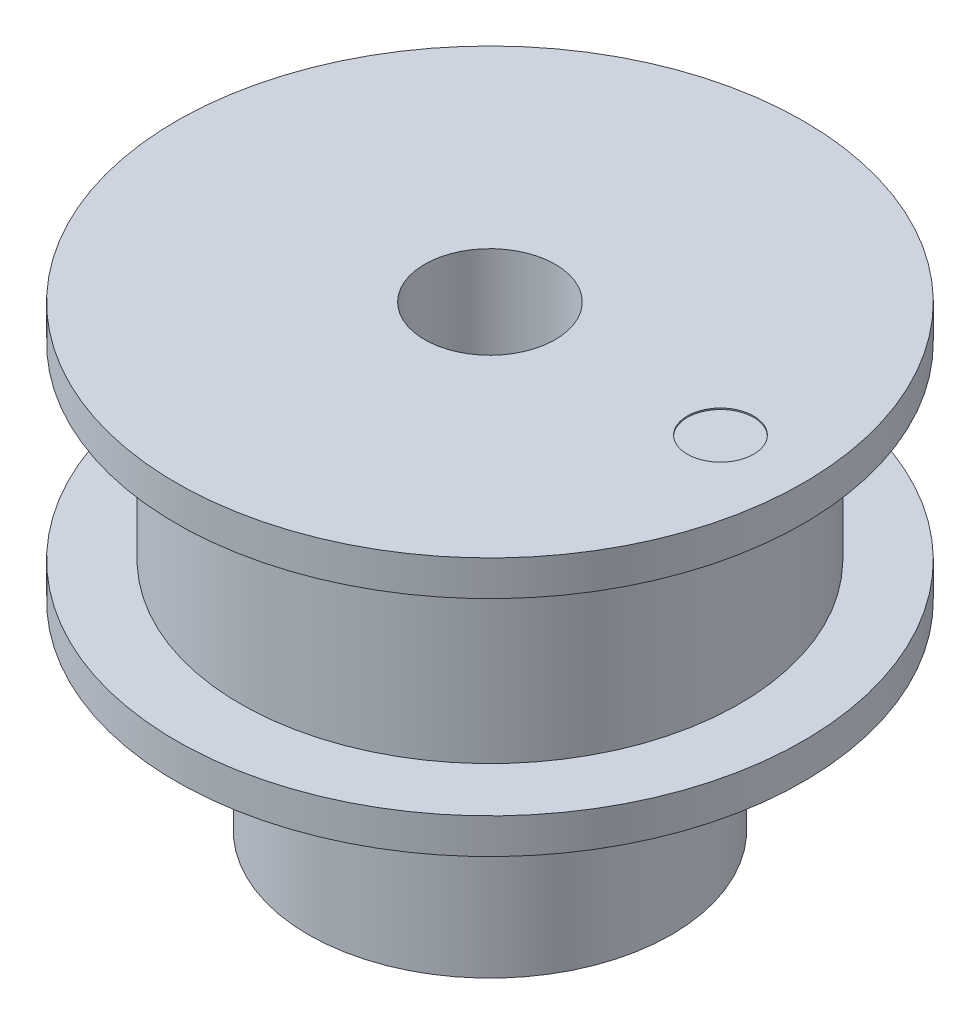
ISO-10303-21;
HEADER;
FILE_DESCRIPTION(('STEP AP214'),'2;1');
FILE_NAME('part.step','',(''),(''),'','','');
FILE_SCHEMA(('AUTOMOTIVE_DESIGN { 1 0 10303 214 1 1 1 1 }'));
ENDSEC;
DATA;
#1=APPLICATION_CONTEXT('core data for automotive mechanical design processes');
#2=APPLICATION_PROTOCOL_DEFINITION('international standard','automotive_design',2000,#1);
#3=PRODUCT_CONTEXT('',#1,'mechanical');
#4=PRODUCT('Part','Part','',(#3));
#5=PRODUCT_RELATED_PRODUCT_CATEGORY('part','',(#4));
#6=PRODUCT_DEFINITION_FORMATION('','',#4);
#7=PRODUCT_DEFINITION_CONTEXT('part definition',#1,'design');
#8=PRODUCT_DEFINITION('design','',#6,#7);
#9=PRODUCT_DEFINITION_SHAPE('','',#8);
#10=(LENGTH_UNIT() NAMED_UNIT(*) SI_UNIT(.MILLI.,.METRE.));
#11=(NAMED_UNIT(*) PLANE_ANGLE_UNIT() SI_UNIT($,.RADIAN.));
#12=(NAMED_UNIT(*) SI_UNIT($,.STERADIAN.) SOLID_ANGLE_UNIT());
#13=UNCERTAINTY_MEASURE_WITH_UNIT(LENGTH_MEASURE(1.E-05),#10,'distance_accuracy_value','');
#14=(GEOMETRIC_REPRESENTATION_CONTEXT(3) GLOBAL_UNCERTAINTY_ASSIGNED_CONTEXT((#13)) GLOBAL_UNIT_ASSIGNED_CONTEXT((#10,
#11,#12)) REPRESENTATION_CONTEXT('',''));
#15=CARTESIAN_POINT('',(0.,0.,0.));
#16=DIRECTION('',(0.,0.,1.));
#17=DIRECTION('',(1.,0.,0.));
#18=AXIS2_PLACEMENT_3D('',#15,#16,#17);
#19=CARTESIAN_POINT('',(12.,17.5,0.));
#20=DIRECTION('',(0.,1.,0.));
#21=DIRECTION('',(0.,0.,1.));
#22=AXIS2_PLACEMENT_3D('',#19,#20,#21);
#23=PLANE('',#22);
#24=CARTESIAN_POINT('',(8.825,17.5,0.));
#25=DIRECTION('',(0.,1.,0.));
#26=DIRECTION('',(0.,0.,1.));
#27=AXIS2_PLACEMENT_3D('',#24,#25,#26);
#28=CIRCLE('',#27,1.27);
#29=CARTESIAN_POINT('',(8.825,17.5,1.27));
#30=VERTEX_POINT('',#29);
#31=EDGE_CURVE('E68',#30,#30,#28,.T.);
#32=ORIENTED_EDGE('',*,*,#31,.F.);
#33=EDGE_LOOP('',(#32));
#34=FACE_BOUND('',#33,.T.);
#35=CARTESIAN_POINT('',(0.,17.5,0.));
#36=DIRECTION('',(0.,-1.,0.));
#37=DIRECTION('',(0.,0.,-1.));
#38=AXIS2_PLACEMENT_3D('',#35,#36,#37);
#39=CIRCLE('',#38,2.5);
#40=CARTESIAN_POINT('',(0.,17.5,-2.5));
#41=VERTEX_POINT('',#40);
#42=EDGE_CURVE('E64',#41,#41,#39,.T.);
#43=ORIENTED_EDGE('',*,*,#42,.T.);
#44=EDGE_LOOP('',(#43));
#45=FACE_BOUND('',#44,.T.);
#46=CARTESIAN_POINT('',(0.,17.5,0.));
#47=DIRECTION('',(0.,-1.,0.));
#48=DIRECTION('',(0.,0.,-1.));
#49=AXIS2_PLACEMENT_3D('',#46,#47,#48);
#50=CIRCLE('',#49,12.);
#51=CARTESIAN_POINT('',(0.,17.5,-12.));
#52=VERTEX_POINT('',#51);
#53=EDGE_CURVE('E10',#52,#52,#50,.T.);
#54=ORIENTED_EDGE('',*,*,#53,.F.);
#55=EDGE_LOOP('',(#54));
#56=FACE_BOUND('',#55,.T.);
#57=ADVANCED_FACE('F30',(#34,#45,#56),#23,.T.);
#58=CARTESIAN_POINT('',(0.,0.,0.));
#59=DIRECTION('',(0.,-1.,0.));
#60=DIRECTION('',(0.,0.,-1.));
#61=AXIS2_PLACEMENT_3D('',#58,#59,#60);
#62=CYLINDRICAL_SURFACE('',#61,12.);
#63=ORIENTED_EDGE('',*,*,#53,.T.);
#64=EDGE_LOOP('',(#63));
#65=FACE_BOUND('',#64,.T.);
#66=CARTESIAN_POINT('',(0.,16.15,0.));
#67=DIRECTION('',(0.,-1.,0.));
#68=DIRECTION('',(0.,0.,-1.));
#69=AXIS2_PLACEMENT_3D('',#66,#67,#68);
#70=CIRCLE('',#69,12.);
#71=CARTESIAN_POINT('',(0.,16.15,-12.));
#72=VERTEX_POINT('',#71);
#73=EDGE_CURVE('E36',#72,#72,#70,.T.);
#74=ORIENTED_EDGE('',*,*,#73,.F.);
#75=EDGE_LOOP('',(#74));
#76=FACE_BOUND('',#75,.T.);
#77=ADVANCED_FACE('F85',(#65,#76),#62,.T.);
#78=CARTESIAN_POINT('',(9.55,16.15,0.));
#79=DIRECTION('',(0.,-1.,0.));
#80=DIRECTION('',(0.,0.,-1.));
#81=AXIS2_PLACEMENT_3D('',#78,#79,#80);
#82=PLANE('',#81);
#83=ORIENTED_EDGE('',*,*,#73,.T.);
#84=EDGE_LOOP('',(#83));
#85=FACE_BOUND('',#84,.T.);
#86=CARTESIAN_POINT('',(0.,16.15,0.));
#87=DIRECTION('',(0.,-1.,0.));
#88=DIRECTION('',(0.,0.,-1.));
#89=AXIS2_PLACEMENT_3D('',#86,#87,#88);
#90=CIRCLE('',#89,9.55);
#91=CARTESIAN_POINT('',(0.,16.15,-9.55));
#92=VERTEX_POINT('',#91);
#93=EDGE_CURVE('E40',#92,#92,#90,.T.);
#94=ORIENTED_EDGE('',*,*,#93,.F.);
#95=EDGE_LOOP('',(#94));
#96=FACE_BOUND('',#95,.T.);
#97=ADVANCED_FACE('F119',(#85,#96),#82,.T.);
#98=CARTESIAN_POINT('',(0.,0.,0.));
#99=DIRECTION('',(0.,-1.,0.));
#100=DIRECTION('',(0.,0.,-1.));
#101=AXIS2_PLACEMENT_3D('',#98,#99,#100);
#102=CYLINDRICAL_SURFACE('',#101,9.55);
#103=ORIENTED_EDGE('',*,*,#93,.T.);
#104=EDGE_LOOP('',(#103));
#105=FACE_BOUND('',#104,.T.);
#106=CARTESIAN_POINT('',(0.,8.95,0.));
#107=DIRECTION('',(0.,-1.,0.));
#108=DIRECTION('',(0.,0.,-1.));
#109=AXIS2_PLACEMENT_3D('',#106,#107,#108);
#110=CIRCLE('',#109,9.55);
#111=CARTESIAN_POINT('',(0.,8.95,-9.55));
#112=VERTEX_POINT('',#111);
#113=EDGE_CURVE('E44',#112,#112,#110,.T.);
#114=ORIENTED_EDGE('',*,*,#113,.F.);
#115=EDGE_LOOP('',(#114));
#116=FACE_BOUND('',#115,.T.);
#117=ADVANCED_FACE('F115',(#105,#116),#102,.T.);
#118=CARTESIAN_POINT('',(12.,8.95,0.));
#119=DIRECTION('',(0.,1.,0.));
#120=DIRECTION('',(0.,0.,1.));
#121=AXIS2_PLACEMENT_3D('',#118,#119,#120);
#122=PLANE('',#121);
#123=ORIENTED_EDGE('',*,*,#113,.T.);
#124=EDGE_LOOP('',(#123));
#125=FACE_BOUND('',#124,.T.);
#126=CARTESIAN_POINT('',(0.,8.95,0.));
#127=DIRECTION('',(0.,-1.,0.));
#128=DIRECTION('',(0.,0.,-1.));
#129=AXIS2_PLACEMENT_3D('',#126,#127,#128);
#130=CIRCLE('',#129,12.);
#131=CARTESIAN_POINT('',(0.,8.95,-12.));
#132=VERTEX_POINT('',#131);
#133=EDGE_CURVE('E49',#132,#132,#130,.T.);
#134=ORIENTED_EDGE('',*,*,#133,.F.);
#135=EDGE_LOOP('',(#134));
#136=FACE_BOUND('',#135,.T.);
#137=ADVANCED_FACE('F111',(#125,#136),#122,.T.);
#138=CARTESIAN_POINT('',(0.,0.,0.));
#139=DIRECTION('',(0.,-1.,0.));
#140=DIRECTION('',(0.,0.,-1.));
#141=AXIS2_PLACEMENT_3D('',#138,#139,#140);
#142=CYLINDRICAL_SURFACE('',#141,12.);
#143=ORIENTED_EDGE('',*,*,#133,.T.);
#144=EDGE_LOOP('',(#143));
#145=FACE_BOUND('',#144,.T.);
#146=CARTESIAN_POINT('',(0.,7.6,0.));
#147=DIRECTION('',(0.,-1.,0.));
#148=DIRECTION('',(0.,0.,-1.));
#149=AXIS2_PLACEMENT_3D('',#146,#147,#148);
#150=CIRCLE('',#149,12.);
#151=CARTESIAN_POINT('',(0.,7.6,-12.));
#152=VERTEX_POINT('',#151);
#153=EDGE_CURVE('E52',#152,#152,#150,.T.);
#154=ORIENTED_EDGE('',*,*,#153,.F.);
#155=EDGE_LOOP('',(#154));
#156=FACE_BOUND('',#155,.T.);
#157=ADVANCED_FACE('F107',(#145,#156),#142,.T.);
#158=CARTESIAN_POINT('',(6.95,7.6,0.));
#159=DIRECTION('',(0.,-1.,0.));
#160=DIRECTION('',(0.,0.,-1.));
#161=AXIS2_PLACEMENT_3D('',#158,#159,#160);
#162=PLANE('',#161);
#163=ORIENTED_EDGE('',*,*,#153,.T.);
#164=EDGE_LOOP('',(#163));
#165=FACE_BOUND('',#164,.T.);
#166=CARTESIAN_POINT('',(0.,7.6,0.));
#167=DIRECTION('',(0.,-1.,0.));
#168=DIRECTION('',(0.,0.,-1.));
#169=AXIS2_PLACEMENT_3D('',#166,#167,#168);
#170=CIRCLE('',#169,6.95);
#171=CARTESIAN_POINT('',(0.,7.6,-6.95));
#172=VERTEX_POINT('',#171);
#173=EDGE_CURVE('E55',#172,#172,#170,.T.);
#174=ORIENTED_EDGE('',*,*,#173,.F.);
#175=EDGE_LOOP('',(#174));
#176=FACE_BOUND('',#175,.T.);
#177=ADVANCED_FACE('F103',(#165,#176),#162,.T.);
#178=CARTESIAN_POINT('',(0.,0.,0.));
#179=DIRECTION('',(0.,-1.,0.));
#180=DIRECTION('',(0.,0.,-1.));
#181=AXIS2_PLACEMENT_3D('',#178,#179,#180);
#182=CYLINDRICAL_SURFACE('',#181,6.95);
#183=ORIENTED_EDGE('',*,*,#173,.T.);
#184=EDGE_LOOP('',(#183));
#185=FACE_BOUND('',#184,.T.);
#186=CARTESIAN_POINT('',(0.,0.,0.));
#187=DIRECTION('',(0.,-1.,0.));
#188=DIRECTION('',(0.,0.,-1.));
#189=AXIS2_PLACEMENT_3D('',#186,#187,#188);
#190=CIRCLE('',#189,6.95);
#191=CARTESIAN_POINT('',(0.,0.,-6.95));
#192=VERTEX_POINT('',#191);
#193=EDGE_CURVE('E58',#192,#192,#190,.T.);
#194=ORIENTED_EDGE('',*,*,#193,.F.);
#195=EDGE_LOOP('',(#194));
#196=FACE_BOUND('',#195,.T.);
#197=ADVANCED_FACE('F96',(#185,#196),#182,.T.);
#198=CARTESIAN_POINT('',(2.5,0.,0.));
#199=DIRECTION('',(0.,-1.,0.));
#200=DIRECTION('',(0.,0.,-1.));
#201=AXIS2_PLACEMENT_3D('',#198,#199,#200);
#202=PLANE('',#201);
#203=ORIENTED_EDGE('',*,*,#193,.T.);
#204=EDGE_LOOP('',(#203));
#205=FACE_BOUND('',#204,.T.);
#206=CARTESIAN_POINT('',(0.,0.,0.));
#207=DIRECTION('',(0.,-1.,0.));
#208=DIRECTION('',(0.,0.,-1.));
#209=AXIS2_PLACEMENT_3D('',#206,#207,#208);
#210=CIRCLE('',#209,2.5);
#211=CARTESIAN_POINT('',(0.,0.,-2.5));
#212=VERTEX_POINT('',#211);
#213=EDGE_CURVE('E61',#212,#212,#210,.T.);
#214=ORIENTED_EDGE('',*,*,#213,.F.);
#215=EDGE_LOOP('',(#214));
#216=FACE_BOUND('',#215,.T.);
#217=ADVANCED_FACE('F90',(#205,#216),#202,.T.);
#218=CARTESIAN_POINT('',(0.,0.,0.));
#219=DIRECTION('',(0.,-1.,0.));
#220=DIRECTION('',(0.,0.,-1.));
#221=AXIS2_PLACEMENT_3D('',#218,#219,#220);
#222=CYLINDRICAL_SURFACE('',#221,2.5);
#223=ORIENTED_EDGE('',*,*,#213,.T.);
#224=EDGE_LOOP('',(#223));
#225=FACE_BOUND('',#224,.T.);
#226=ORIENTED_EDGE('',*,*,#42,.F.);
#227=EDGE_LOOP('',(#226));
#228=FACE_BOUND('',#227,.T.);
#229=ADVANCED_FACE('F79',(#225,#228),#222,.F.);
#230=CARTESIAN_POINT('',(8.825,17.4492,0.));
#231=DIRECTION('',(0.,1.,0.));
#232=DIRECTION('',(0.,0.,1.));
#233=AXIS2_PLACEMENT_3D('',#230,#231,#232);
#234=CYLINDRICAL_SURFACE('',#233,1.27);
#235=CARTESIAN_POINT('',(8.825,17.4492,0.));
#236=DIRECTION('',(0.,1.,0.));
#237=DIRECTION('',(0.,0.,1.));
#238=AXIS2_PLACEMENT_3D('',#235,#236,#237);
#239=CIRCLE('',#238,1.27);
#240=CARTESIAN_POINT('',(8.825,17.4492,1.27));
#241=VERTEX_POINT('',#240);
#242=EDGE_CURVE('E67',#241,#241,#239,.T.);
#243=ORIENTED_EDGE('',*,*,#242,.F.);
#244=EDGE_LOOP('',(#243));
#245=FACE_BOUND('',#244,.T.);
#246=ORIENTED_EDGE('',*,*,#31,.T.);
#247=EDGE_LOOP('',(#246));
#248=FACE_BOUND('',#247,.T.);
#249=ADVANCED_FACE('F76',(#245,#248),#234,.F.);
#250=CARTESIAN_POINT('',(8.825,17.4492,0.));
#251=DIRECTION('',(0.,1.,0.));
#252=DIRECTION('',(0.,0.,1.));
#253=AXIS2_PLACEMENT_3D('',#250,#251,#252);
#254=PLANE('',#253);
#255=ORIENTED_EDGE('',*,*,#242,.T.);
#256=EDGE_LOOP('',(#255));
#257=FACE_BOUND('',#256,.T.);
#258=ADVANCED_FACE('F74',(#257),#254,.T.);
#259=CLOSED_SHELL('',(#57,#77,#97,#117,#137,#157,#177,#197,#217,#229,#249,#258));
#260=MANIFOLD_SOLID_BREP('B2',#259);
#261=ADVANCED_BREP_SHAPE_REPRESENTATION('',(#18,#260),#14);
#262=SHAPE_DEFINITION_REPRESENTATION(#9,#261);
ENDSEC;
END-ISO-10303-21;
